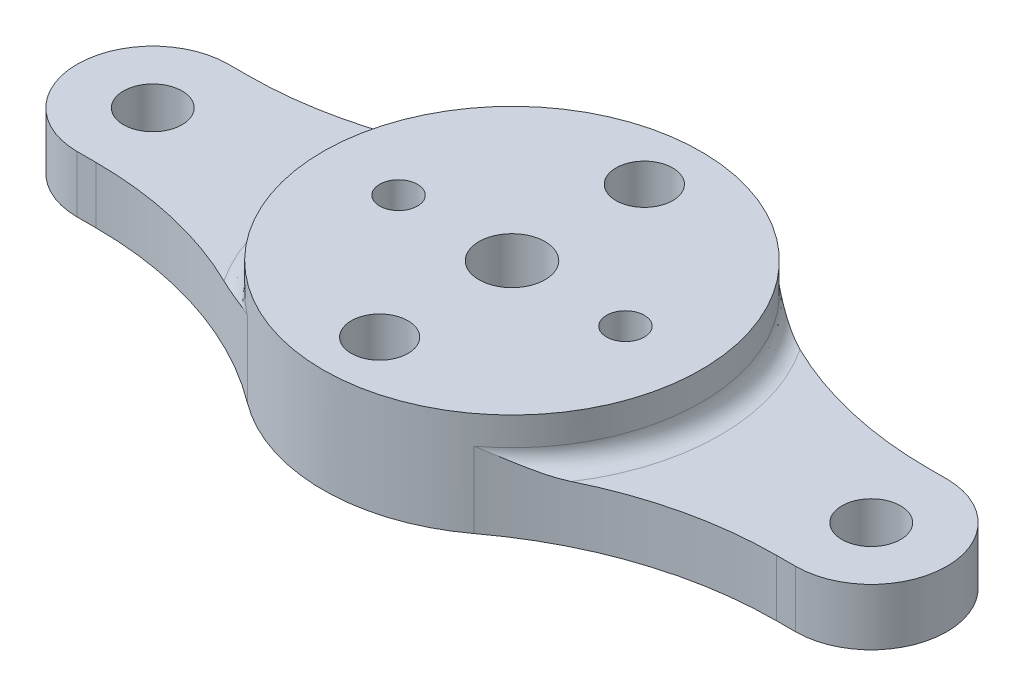
ISO-10303-21;
HEADER;
FILE_DESCRIPTION(('STEP AP214'),'2;1');
FILE_NAME('part.step','',(''),(''),'','','');
FILE_SCHEMA(('AUTOMOTIVE_DESIGN { 1 0 10303 214 1 1 1 1 }'));
ENDSEC;
DATA;
#1=APPLICATION_CONTEXT('core data for automotive mechanical design processes');
#2=APPLICATION_PROTOCOL_DEFINITION('international standard','automotive_design',2000,#1);
#3=PRODUCT_CONTEXT('',#1,'mechanical');
#4=PRODUCT('Part','Part','',(#3));
#5=PRODUCT_RELATED_PRODUCT_CATEGORY('part','',(#4));
#6=PRODUCT_DEFINITION_FORMATION('','',#4);
#7=PRODUCT_DEFINITION_CONTEXT('part definition',#1,'design');
#8=PRODUCT_DEFINITION('design','',#6,#7);
#9=PRODUCT_DEFINITION_SHAPE('','',#8);
#10=(LENGTH_UNIT() NAMED_UNIT(*) SI_UNIT(.MILLI.,.METRE.));
#11=(NAMED_UNIT(*) PLANE_ANGLE_UNIT() SI_UNIT($,.RADIAN.));
#12=(NAMED_UNIT(*) SI_UNIT($,.STERADIAN.) SOLID_ANGLE_UNIT());
#13=UNCERTAINTY_MEASURE_WITH_UNIT(LENGTH_MEASURE(1.E-05),#10,'distance_accuracy_value','');
#14=(GEOMETRIC_REPRESENTATION_CONTEXT(3) GLOBAL_UNCERTAINTY_ASSIGNED_CONTEXT((#13)) GLOBAL_UNIT_ASSIGNED_CONTEXT((#10,
#11,#12)) REPRESENTATION_CONTEXT('',''));
#15=CARTESIAN_POINT('',(0.,0.,0.));
#16=DIRECTION('',(0.,0.,1.));
#17=DIRECTION('',(1.,0.,0.));
#18=AXIS2_PLACEMENT_3D('',#15,#16,#17);
#19=CARTESIAN_POINT('',(0.,-2.49999999998515E-05,-7.));
#20=DIRECTION('',(0.,1.,0.));
#21=DIRECTION('',(0.,0.,1.));
#22=AXIS2_PLACEMENT_3D('',#19,#20,#21);
#23=CYLINDRICAL_SURFACE('',#22,1.5);
#24=CARTESIAN_POINT('',(0.,5.5,-7.));
#25=DIRECTION('',(0.,1.,0.));
#26=DIRECTION('',(0.,0.,1.));
#27=AXIS2_PLACEMENT_3D('',#24,#25,#26);
#28=CIRCLE('',#27,1.5);
#29=CARTESIAN_POINT('',(0.,5.5,-5.5));
#30=VERTEX_POINT('',#29);
#31=EDGE_CURVE('E337',#30,#30,#28,.T.);
#32=ORIENTED_EDGE('',*,*,#31,.T.);
#33=EDGE_LOOP('',(#32));
#34=FACE_BOUND('',#33,.T.);
#35=CARTESIAN_POINT('',(0.,2.1,-7.));
#36=DIRECTION('',(0.,-1.,0.));
#37=DIRECTION('',(0.,0.,-1.));
#38=AXIS2_PLACEMENT_3D('',#35,#36,#37);
#39=CIRCLE('',#38,1.5);
#40=CARTESIAN_POINT('',(0.,2.1,-8.5));
#41=VERTEX_POINT('',#40);
#42=EDGE_CURVE('E293',#41,#41,#39,.F.);
#43=ORIENTED_EDGE('',*,*,#42,.F.);
#44=EDGE_LOOP('',(#43));
#45=FACE_BOUND('',#44,.T.);
#46=ADVANCED_FACE('F35',(#34,#45),#23,.F.);
#47=CARTESIAN_POINT('',(0.,-2.49999999998515E-05,7.));
#48=DIRECTION('',(0.,1.,0.));
#49=DIRECTION('',(0.,0.,1.));
#50=AXIS2_PLACEMENT_3D('',#47,#48,#49);
#51=CYLINDRICAL_SURFACE('',#50,1.5);
#52=CARTESIAN_POINT('',(0.,5.5,7.));
#53=DIRECTION('',(0.,1.,0.));
#54=DIRECTION('',(0.,0.,1.));
#55=AXIS2_PLACEMENT_3D('',#52,#53,#54);
#56=CIRCLE('',#55,1.5);
#57=CARTESIAN_POINT('',(0.,5.5,8.5));
#58=VERTEX_POINT('',#57);
#59=EDGE_CURVE('E334',#58,#58,#56,.T.);
#60=ORIENTED_EDGE('',*,*,#59,.T.);
#61=EDGE_LOOP('',(#60));
#62=FACE_BOUND('',#61,.T.);
#63=CARTESIAN_POINT('',(0.,2.1,7.));
#64=DIRECTION('',(0.,-1.,0.));
#65=DIRECTION('',(0.,0.,-1.));
#66=AXIS2_PLACEMENT_3D('',#63,#64,#65);
#67=CIRCLE('',#66,1.5);
#68=CARTESIAN_POINT('',(0.,2.1,5.5));
#69=VERTEX_POINT('',#68);
#70=EDGE_CURVE('E306',#69,#69,#67,.F.);
#71=ORIENTED_EDGE('',*,*,#70,.F.);
#72=EDGE_LOOP('',(#71));
#73=FACE_BOUND('',#72,.T.);
#74=ADVANCED_FACE('F380',(#62,#73),#51,.F.);
#75=CARTESIAN_POINT('',(0.,3.,0.));
#76=DIRECTION('',(0.,1.,0.));
#77=DIRECTION('',(0.,0.,1.));
#78=AXIS2_PLACEMENT_3D('',#75,#76,#77);
#79=PLANE('',#78);
#80=CARTESIAN_POINT('',(18.,3.,-24.));
#81=DIRECTION('',(0.,1.,0.));
#82=DIRECTION('',(0.,0.,1.));
#83=AXIS2_PLACEMENT_3D('',#80,#81,#82);
#84=CIRCLE('',#83,20.);
#85=CARTESIAN_POINT('',(18.,3.,-4.));
#86=VERTEX_POINT('',#85);
#87=CARTESIAN_POINT('',(9.19020133548054,3.,-6.0448489983896));
#88=VERTEX_POINT('',#87);
#89=EDGE_CURVE('E217',#86,#88,#84,.F.);
#90=ORIENTED_EDGE('',*,*,#89,.T.);
#91=CARTESIAN_POINT('',(0.,3.,0.));
#92=DIRECTION('',(0.,1.,0.));
#93=DIRECTION('',(0.,0.,1.));
#94=AXIS2_PLACEMENT_3D('',#91,#92,#93);
#95=CIRCLE('',#94,11.);
#96=CARTESIAN_POINT('',(9.19020133548054,3.,6.0448489983896));
#97=VERTEX_POINT('',#96);
#98=EDGE_CURVE('E236',#88,#97,#95,.F.);
#99=ORIENTED_EDGE('',*,*,#98,.T.);
#100=CARTESIAN_POINT('',(18.,3.,24.));
#101=DIRECTION('',(0.,1.,0.));
#102=DIRECTION('',(0.,0.,1.));
#103=AXIS2_PLACEMENT_3D('',#100,#101,#102);
#104=CIRCLE('',#103,20.);
#105=CARTESIAN_POINT('',(18.,3.,4.));
#106=VERTEX_POINT('',#105);
#107=EDGE_CURVE('E150',#97,#106,#104,.F.);
#108=ORIENTED_EDGE('',*,*,#107,.T.);
#109=DIRECTION('',(1.,0.,0.));
#110=VECTOR('',#109,1.);
#111=CARTESIAN_POINT('',(9.16515138991168,3.,4.));
#112=LINE('',#111,#110);
#113=CARTESIAN_POINT('',(19.,3.,4.));
#114=VERTEX_POINT('',#113);
#115=EDGE_CURVE('E140',#106,#114,#112,.T.);
#116=ORIENTED_EDGE('',*,*,#115,.T.);
#117=CARTESIAN_POINT('',(19.,3.,0.));
#118=DIRECTION('',(0.,1.,0.));
#119=DIRECTION('',(0.,0.,1.));
#120=AXIS2_PLACEMENT_3D('',#117,#118,#119);
#121=CIRCLE('',#120,4.);
#122=CARTESIAN_POINT('',(19.,3.,-4.));
#123=VERTEX_POINT('',#122);
#124=EDGE_CURVE('E147',#114,#123,#121,.T.);
#125=ORIENTED_EDGE('',*,*,#124,.T.);
#126=DIRECTION('',(-1.,0.,0.));
#127=VECTOR('',#126,1.);
#128=CARTESIAN_POINT('',(9.16515138991168,3.,-4.));
#129=LINE('',#128,#127);
#130=EDGE_CURVE('E169',#123,#86,#129,.T.);
#131=ORIENTED_EDGE('',*,*,#130,.T.);
#132=EDGE_LOOP('',(#90,#99,#108,#116,#125,#131));
#133=FACE_BOUND('',#132,.T.);
#134=CARTESIAN_POINT('',(19.,3.,0.));
#135=DIRECTION('',(0.,1.,0.));
#136=DIRECTION('',(0.,0.,1.));
#137=AXIS2_PLACEMENT_3D('',#134,#135,#136);
#138=CIRCLE('',#137,1.55);
#139=CARTESIAN_POINT('',(19.,3.,1.55));
#140=VERTEX_POINT('',#139);
#141=EDGE_CURVE('E350',#140,#140,#138,.T.);
#142=ORIENTED_EDGE('',*,*,#141,.F.);
#143=EDGE_LOOP('',(#142));
#144=FACE_BOUND('',#143,.T.);
#145=ADVANCED_FACE('F143',(#133,#144),#79,.T.);
#146=CARTESIAN_POINT('',(-18.,3.,24.));
#147=DIRECTION('',(0.,1.,0.));
#148=DIRECTION('',(0.,0.,1.));
#149=AXIS2_PLACEMENT_3D('',#146,#147,#148);
#150=CIRCLE('',#149,20.);
#151=CARTESIAN_POINT('',(-18.,3.,4.));
#152=VERTEX_POINT('',#151);
#153=CARTESIAN_POINT('',(-9.19020133548054,3.,6.04484899838959));
#154=VERTEX_POINT('',#153);
#155=EDGE_CURVE('E225',#152,#154,#150,.F.);
#156=ORIENTED_EDGE('',*,*,#155,.T.);
#157=CARTESIAN_POINT('',(0.,3.,0.));
#158=DIRECTION('',(0.,1.,0.));
#159=DIRECTION('',(0.,0.,1.));
#160=AXIS2_PLACEMENT_3D('',#157,#158,#159);
#161=CIRCLE('',#160,11.);
#162=CARTESIAN_POINT('',(-9.19020133548054,3.,-6.04484899838959));
#163=VERTEX_POINT('',#162);
#164=EDGE_CURVE('E61',#154,#163,#161,.F.);
#165=ORIENTED_EDGE('',*,*,#164,.T.);
#166=CARTESIAN_POINT('',(-18.,3.,-24.));
#167=DIRECTION('',(0.,1.,0.));
#168=DIRECTION('',(0.,0.,1.));
#169=AXIS2_PLACEMENT_3D('',#166,#167,#168);
#170=CIRCLE('',#169,20.);
#171=CARTESIAN_POINT('',(-18.,3.,-4.));
#172=VERTEX_POINT('',#171);
#173=EDGE_CURVE('E221',#163,#172,#170,.F.);
#174=ORIENTED_EDGE('',*,*,#173,.T.);
#175=DIRECTION('',(-1.,0.,0.));
#176=VECTOR('',#175,1.);
#177=CARTESIAN_POINT('',(-19.,3.,-4.));
#178=LINE('',#177,#176);
#179=CARTESIAN_POINT('',(-19.,3.,-4.));
#180=VERTEX_POINT('',#179);
#181=EDGE_CURVE('E171',#172,#180,#178,.T.);
#182=ORIENTED_EDGE('',*,*,#181,.T.);
#183=CARTESIAN_POINT('',(-19.,3.,0.));
#184=DIRECTION('',(0.,1.,0.));
#185=DIRECTION('',(0.,0.,1.));
#186=AXIS2_PLACEMENT_3D('',#183,#184,#185);
#187=CIRCLE('',#186,4.);
#188=CARTESIAN_POINT('',(-19.,3.,4.));
#189=VERTEX_POINT('',#188);
#190=EDGE_CURVE('E177',#180,#189,#187,.T.);
#191=ORIENTED_EDGE('',*,*,#190,.T.);
#192=DIRECTION('',(1.,0.,0.));
#193=VECTOR('',#192,1.);
#194=CARTESIAN_POINT('',(-19.,3.,4.));
#195=LINE('',#194,#193);
#196=EDGE_CURVE('E179',#189,#152,#195,.T.);
#197=ORIENTED_EDGE('',*,*,#196,.T.);
#198=EDGE_LOOP('',(#156,#165,#174,#182,#191,#197));
#199=FACE_BOUND('',#198,.T.);
#200=CARTESIAN_POINT('',(-19.,3.,0.));
#201=DIRECTION('',(0.,1.,0.));
#202=DIRECTION('',(0.,0.,1.));
#203=AXIS2_PLACEMENT_3D('',#200,#201,#202);
#204=CIRCLE('',#203,1.55);
#205=CARTESIAN_POINT('',(-19.,3.,1.55));
#206=VERTEX_POINT('',#205);
#207=EDGE_CURVE('E183',#206,#206,#204,.T.);
#208=ORIENTED_EDGE('',*,*,#207,.F.);
#209=EDGE_LOOP('',(#208));
#210=FACE_BOUND('',#209,.T.);
#211=ADVANCED_FACE('F431',(#199,#210),#79,.T.);
#212=CARTESIAN_POINT('',(0.,0.,0.));
#213=DIRECTION('',(0.,1.,0.));
#214=DIRECTION('',(0.,0.,1.));
#215=AXIS2_PLACEMENT_3D('',#212,#213,#214);
#216=PLANE('',#215);
#217=CARTESIAN_POINT('',(0.,0.,-7.));
#218=DIRECTION('',(0.,-1.,0.));
#219=DIRECTION('',(0.,0.,-1.));
#220=AXIS2_PLACEMENT_3D('',#217,#218,#219);
#221=CIRCLE('',#220,2.6);
#222=CARTESIAN_POINT('',(0.,0.,-9.6));
#223=VERTEX_POINT('',#222);
#224=EDGE_CURVE('E323',#223,#223,#221,.T.);
#225=ORIENTED_EDGE('',*,*,#224,.F.);
#226=EDGE_LOOP('',(#225));
#227=FACE_BOUND('',#226,.T.);
#228=CARTESIAN_POINT('',(0.,0.,7.));
#229=DIRECTION('',(0.,-1.,0.));
#230=DIRECTION('',(0.,0.,-1.));
#231=AXIS2_PLACEMENT_3D('',#228,#229,#230);
#232=CIRCLE('',#231,2.6);
#233=CARTESIAN_POINT('',(0.,0.,4.4));
#234=VERTEX_POINT('',#233);
#235=EDGE_CURVE('E316',#234,#234,#232,.T.);
#236=ORIENTED_EDGE('',*,*,#235,.F.);
#237=EDGE_LOOP('',(#236));
#238=FACE_BOUND('',#237,.T.);
#239=CARTESIAN_POINT('',(6.,0.,0.));
#240=DIRECTION('',(0.,1.,0.));
#241=DIRECTION('',(0.,0.,1.));
#242=AXIS2_PLACEMENT_3D('',#239,#240,#241);
#243=CIRCLE('',#242,1.);
#244=CARTESIAN_POINT('',(6.,0.,1.));
#245=VERTEX_POINT('',#244);
#246=EDGE_CURVE('E313',#245,#245,#243,.T.);
#247=ORIENTED_EDGE('',*,*,#246,.T.);
#248=EDGE_LOOP('',(#247));
#249=FACE_BOUND('',#248,.T.);
#250=CARTESIAN_POINT('',(-6.,0.,0.));
#251=DIRECTION('',(0.,1.,0.));
#252=DIRECTION('',(0.,0.,1.));
#253=AXIS2_PLACEMENT_3D('',#250,#251,#252);
#254=CIRCLE('',#253,1.);
#255=CARTESIAN_POINT('',(-6.,0.,1.));
#256=VERTEX_POINT('',#255);
#257=EDGE_CURVE('E331',#256,#256,#254,.T.);
#258=ORIENTED_EDGE('',*,*,#257,.T.);
#259=EDGE_LOOP('',(#258));
#260=FACE_BOUND('',#259,.T.);
#261=CARTESIAN_POINT('',(0.,0.,0.));
#262=DIRECTION('',(0.,1.,0.));
#263=DIRECTION('',(0.,0.,1.));
#264=AXIS2_PLACEMENT_3D('',#261,#262,#263);
#265=CIRCLE('',#264,1.75);
#266=CARTESIAN_POINT('',(0.,0.,1.75));
#267=VERTEX_POINT('',#266);
#268=EDGE_CURVE('E343',#267,#267,#265,.T.);
#269=ORIENTED_EDGE('',*,*,#268,.T.);
#270=EDGE_LOOP('',(#269));
#271=FACE_BOUND('',#270,.T.);
#272=CARTESIAN_POINT('',(0.,0.,0.));
#273=DIRECTION('',(0.,1.,0.));
#274=DIRECTION('',(0.,0.,1.));
#275=AXIS2_PLACEMENT_3D('',#272,#273,#274);
#276=CIRCLE('',#275,10.);
#277=CARTESIAN_POINT('',(-6.,0.,8.));
#278=VERTEX_POINT('',#277);
#279=CARTESIAN_POINT('',(6.,0.,8.));
#280=VERTEX_POINT('',#279);
#281=EDGE_CURVE('E180',#278,#280,#276,.T.);
#282=ORIENTED_EDGE('',*,*,#281,.F.);
#283=CARTESIAN_POINT('',(-18.,0.,24.));
#284=DIRECTION('',(0.,1.,0.));
#285=DIRECTION('',(0.,0.,1.));
#286=AXIS2_PLACEMENT_3D('',#283,#284,#285);
#287=CIRCLE('',#286,20.);
#288=CARTESIAN_POINT('',(-18.,0.,4.));
#289=VERTEX_POINT('',#288);
#290=EDGE_CURVE('E223',#278,#289,#287,.T.);
#291=ORIENTED_EDGE('',*,*,#290,.T.);
#292=DIRECTION('',(1.,0.,0.));
#293=VECTOR('',#292,1.);
#294=CARTESIAN_POINT('',(-19.,0.,4.));
#295=LINE('',#294,#293);
#296=CARTESIAN_POINT('',(-19.,0.,4.));
#297=VERTEX_POINT('',#296);
#298=EDGE_CURVE('E154',#297,#289,#295,.T.);
#299=ORIENTED_EDGE('',*,*,#298,.F.);
#300=CARTESIAN_POINT('',(-19.,0.,0.));
#301=DIRECTION('',(0.,1.,0.));
#302=DIRECTION('',(0.,0.,1.));
#303=AXIS2_PLACEMENT_3D('',#300,#301,#302);
#304=CIRCLE('',#303,4.);
#305=CARTESIAN_POINT('',(-19.,0.,-4.));
#306=VERTEX_POINT('',#305);
#307=EDGE_CURVE('E195',#306,#297,#304,.T.);
#308=ORIENTED_EDGE('',*,*,#307,.F.);
#309=DIRECTION('',(-1.,0.,0.));
#310=VECTOR('',#309,1.);
#311=CARTESIAN_POINT('',(-19.,0.,-4.));
#312=LINE('',#311,#310);
#313=CARTESIAN_POINT('',(-18.,0.,-4.));
#314=VERTEX_POINT('',#313);
#315=EDGE_CURVE('E193',#314,#306,#312,.T.);
#316=ORIENTED_EDGE('',*,*,#315,.F.);
#317=CARTESIAN_POINT('',(-18.,0.,-24.));
#318=DIRECTION('',(0.,1.,0.));
#319=DIRECTION('',(0.,0.,1.));
#320=AXIS2_PLACEMENT_3D('',#317,#318,#319);
#321=CIRCLE('',#320,20.);
#322=CARTESIAN_POINT('',(-6.,0.,-8.));
#323=VERTEX_POINT('',#322);
#324=EDGE_CURVE('E219',#314,#323,#321,.T.);
#325=ORIENTED_EDGE('',*,*,#324,.T.);
#326=CARTESIAN_POINT('',(0.,0.,0.));
#327=DIRECTION('',(0.,1.,0.));
#328=DIRECTION('',(0.,0.,1.));
#329=AXIS2_PLACEMENT_3D('',#326,#327,#328);
#330=CIRCLE('',#329,10.);
#331=CARTESIAN_POINT('',(6.,0.,-8.));
#332=VERTEX_POINT('',#331);
#333=EDGE_CURVE('E190',#332,#323,#330,.T.);
#334=ORIENTED_EDGE('',*,*,#333,.F.);
#335=CARTESIAN_POINT('',(18.,0.,-24.));
#336=DIRECTION('',(0.,1.,0.));
#337=DIRECTION('',(0.,0.,1.));
#338=AXIS2_PLACEMENT_3D('',#335,#336,#337);
#339=CIRCLE('',#338,20.);
#340=CARTESIAN_POINT('',(18.,0.,-4.));
#341=VERTEX_POINT('',#340);
#342=EDGE_CURVE('E215',#332,#341,#339,.T.);
#343=ORIENTED_EDGE('',*,*,#342,.T.);
#344=DIRECTION('',(-1.,0.,0.));
#345=VECTOR('',#344,1.);
#346=CARTESIAN_POINT('',(9.16515138991168,0.,-4.));
#347=LINE('',#346,#345);
#348=CARTESIAN_POINT('',(19.,0.,-4.));
#349=VERTEX_POINT('',#348);
#350=EDGE_CURVE('E187',#349,#341,#347,.T.);
#351=ORIENTED_EDGE('',*,*,#350,.F.);
#352=CARTESIAN_POINT('',(19.,0.,0.));
#353=DIRECTION('',(0.,1.,0.));
#354=DIRECTION('',(0.,0.,1.));
#355=AXIS2_PLACEMENT_3D('',#352,#353,#354);
#356=CIRCLE('',#355,4.);
#357=CARTESIAN_POINT('',(19.,0.,4.));
#358=VERTEX_POINT('',#357);
#359=EDGE_CURVE('E185',#358,#349,#356,.T.);
#360=ORIENTED_EDGE('',*,*,#359,.F.);
#361=DIRECTION('',(1.,0.,0.));
#362=VECTOR('',#361,1.);
#363=CARTESIAN_POINT('',(9.16515138991168,0.,4.));
#364=LINE('',#363,#362);
#365=CARTESIAN_POINT('',(18.,0.,4.));
#366=VERTEX_POINT('',#365);
#367=EDGE_CURVE('E160',#366,#358,#364,.T.);
#368=ORIENTED_EDGE('',*,*,#367,.F.);
#369=CARTESIAN_POINT('',(18.,0.,24.));
#370=DIRECTION('',(0.,1.,0.));
#371=DIRECTION('',(0.,0.,1.));
#372=AXIS2_PLACEMENT_3D('',#369,#370,#371);
#373=CIRCLE('',#372,20.);
#374=EDGE_CURVE('E227',#366,#280,#373,.T.);
#375=ORIENTED_EDGE('',*,*,#374,.T.);
#376=EDGE_LOOP('',(#282,#291,#299,#308,#316,#325,#334,#343,#351,#360,#368,#375));
#377=FACE_BOUND('',#376,.T.);
#378=CARTESIAN_POINT('',(-19.,0.,0.));
#379=DIRECTION('',(0.,1.,0.));
#380=DIRECTION('',(0.,0.,1.));
#381=AXIS2_PLACEMENT_3D('',#378,#379,#380);
#382=CIRCLE('',#381,1.55);
#383=CARTESIAN_POINT('',(-19.,0.,1.55));
#384=VERTEX_POINT('',#383);
#385=EDGE_CURVE('E175',#384,#384,#382,.T.);
#386=ORIENTED_EDGE('',*,*,#385,.T.);
#387=EDGE_LOOP('',(#386));
#388=FACE_BOUND('',#387,.T.);
#389=CARTESIAN_POINT('',(19.,0.,0.));
#390=DIRECTION('',(0.,1.,0.));
#391=DIRECTION('',(0.,0.,1.));
#392=AXIS2_PLACEMENT_3D('',#389,#390,#391);
#393=CIRCLE('',#392,1.55);
#394=CARTESIAN_POINT('',(19.,0.,1.55));
#395=VERTEX_POINT('',#394);
#396=EDGE_CURVE('E349',#395,#395,#393,.T.);
#397=ORIENTED_EDGE('',*,*,#396,.T.);
#398=EDGE_LOOP('',(#397));
#399=FACE_BOUND('',#398,.T.);
#400=ADVANCED_FACE('F360',(#227,#238,#249,#260,#271,#377,#388,#399),#216,.F.);
#401=CARTESIAN_POINT('',(9.16515138991168,3.,4.));
#402=DIRECTION('',(0.,0.,-1.));
#403=DIRECTION('',(-1.,0.,0.));
#404=AXIS2_PLACEMENT_3D('',#401,#402,#403);
#405=PLANE('',#404);
#406=ORIENTED_EDGE('',*,*,#115,.F.);
#407=DIRECTION('',(0.,1.,0.));
#408=VECTOR('',#407,1.);
#409=CARTESIAN_POINT('',(18.,0.,4.));
#410=LINE('',#409,#408);
#411=EDGE_CURVE('E213',#106,#366,#410,.F.);
#412=ORIENTED_EDGE('',*,*,#411,.T.);
#413=ORIENTED_EDGE('',*,*,#367,.T.);
#414=DIRECTION('',(0.,-1.,0.));
#415=VECTOR('',#414,1.);
#416=CARTESIAN_POINT('',(19.,3.,4.));
#417=LINE('',#416,#415);
#418=EDGE_CURVE('E157',#114,#358,#417,.T.);
#419=ORIENTED_EDGE('',*,*,#418,.F.);
#420=EDGE_LOOP('',(#406,#412,#413,#419));
#421=FACE_BOUND('',#420,.T.);
#422=ADVANCED_FACE('F158',(#421),#405,.F.);
#423=CARTESIAN_POINT('',(19.,3.,0.));
#424=DIRECTION('',(0.,-1.,0.));
#425=DIRECTION('',(0.,0.,-1.));
#426=AXIS2_PLACEMENT_3D('',#423,#424,#425);
#427=CYLINDRICAL_SURFACE('',#426,4.);
#428=ORIENTED_EDGE('',*,*,#359,.T.);
#429=DIRECTION('',(0.,-1.,0.));
#430=VECTOR('',#429,1.);
#431=CARTESIAN_POINT('',(19.,3.,-4.));
#432=LINE('',#431,#430);
#433=EDGE_CURVE('E164',#123,#349,#432,.T.);
#434=ORIENTED_EDGE('',*,*,#433,.F.);
#435=ORIENTED_EDGE('',*,*,#124,.F.);
#436=ORIENTED_EDGE('',*,*,#418,.T.);
#437=EDGE_LOOP('',(#428,#434,#435,#436));
#438=FACE_BOUND('',#437,.T.);
#439=ADVANCED_FACE('F166',(#438),#427,.T.);
#440=CARTESIAN_POINT('',(9.16515138991168,3.,-4.));
#441=DIRECTION('',(0.,0.,1.));
#442=DIRECTION('',(1.,0.,0.));
#443=AXIS2_PLACEMENT_3D('',#440,#441,#442);
#444=PLANE('',#443);
#445=ORIENTED_EDGE('',*,*,#350,.T.);
#446=DIRECTION('',(0.,1.,0.));
#447=VECTOR('',#446,1.);
#448=CARTESIAN_POINT('',(18.,3.,-4.));
#449=LINE('',#448,#447);
#450=EDGE_CURVE('E298',#341,#86,#449,.T.);
#451=ORIENTED_EDGE('',*,*,#450,.T.);
#452=ORIENTED_EDGE('',*,*,#130,.F.);
#453=ORIENTED_EDGE('',*,*,#433,.T.);
#454=EDGE_LOOP('',(#445,#451,#452,#453));
#455=FACE_BOUND('',#454,.T.);
#456=ADVANCED_FACE('F413',(#455),#444,.F.);
#457=CARTESIAN_POINT('',(0.,3.,0.));
#458=DIRECTION('',(0.,-1.,0.));
#459=DIRECTION('',(0.,0.,-1.));
#460=AXIS2_PLACEMENT_3D('',#457,#458,#459);
#461=CYLINDRICAL_SURFACE('',#460,10.);
#462=CARTESIAN_POINT('',(0.,4.,0.));
#463=DIRECTION('',(0.,1.,0.));
#464=DIRECTION('',(0.,0.,1.));
#465=AXIS2_PLACEMENT_3D('',#462,#463,#464);
#466=CIRCLE('',#465,10.);
#467=CARTESIAN_POINT('',(6.,4.,8.));
#468=VERTEX_POINT('',#467);
#469=CARTESIAN_POINT('',(6.,4.,-8.));
#470=VERTEX_POINT('',#469);
#471=EDGE_CURVE('E233',#468,#470,#466,.T.);
#472=ORIENTED_EDGE('',*,*,#471,.T.);
#473=DIRECTION('',(0.,-1.,0.));
#474=VECTOR('',#473,1.);
#475=CARTESIAN_POINT('',(6.,3.,-8.));
#476=LINE('',#475,#474);
#477=EDGE_CURVE('E284',#470,#332,#476,.T.);
#478=ORIENTED_EDGE('',*,*,#477,.T.);
#479=ORIENTED_EDGE('',*,*,#333,.T.);
#480=DIRECTION('',(0.,-1.,0.));
#481=VECTOR('',#480,1.);
#482=CARTESIAN_POINT('',(-6.,3.,-8.));
#483=LINE('',#482,#481);
#484=CARTESIAN_POINT('',(-6.,4.,-8.));
#485=VERTEX_POINT('',#484);
#486=EDGE_CURVE('E290',#323,#485,#483,.F.);
#487=ORIENTED_EDGE('',*,*,#486,.T.);
#488=CARTESIAN_POINT('',(0.,4.,0.));
#489=DIRECTION('',(0.,1.,0.));
#490=DIRECTION('',(0.,0.,1.));
#491=AXIS2_PLACEMENT_3D('',#488,#489,#490);
#492=CIRCLE('',#491,10.);
#493=CARTESIAN_POINT('',(-6.,4.,8.));
#494=VERTEX_POINT('',#493);
#495=EDGE_CURVE('E230',#485,#494,#492,.T.);
#496=ORIENTED_EDGE('',*,*,#495,.T.);
#497=DIRECTION('',(0.,-1.,0.));
#498=VECTOR('',#497,1.);
#499=CARTESIAN_POINT('',(-6.,3.,8.));
#500=LINE('',#499,#498);
#501=EDGE_CURVE('E288',#494,#278,#500,.T.);
#502=ORIENTED_EDGE('',*,*,#501,.T.);
#503=ORIENTED_EDGE('',*,*,#281,.T.);
#504=DIRECTION('',(0.,-1.,0.));
#505=VECTOR('',#504,1.);
#506=CARTESIAN_POINT('',(6.,3.,8.));
#507=LINE('',#506,#505);
#508=EDGE_CURVE('E163',#280,#468,#507,.F.);
#509=ORIENTED_EDGE('',*,*,#508,.T.);
#510=EDGE_LOOP('',(#472,#478,#479,#487,#496,#502,#503,#509));
#511=FACE_BOUND('',#510,.T.);
#512=CARTESIAN_POINT('',(0.,5.5,0.));
#513=DIRECTION('',(0.,1.,0.));
#514=DIRECTION('',(0.,0.,1.));
#515=AXIS2_PLACEMENT_3D('',#512,#513,#514);
#516=CIRCLE('',#515,10.);
#517=CARTESIAN_POINT('',(0.,5.5,10.));
#518=VERTEX_POINT('',#517);
#519=EDGE_CURVE('E346',#518,#518,#516,.T.);
#520=ORIENTED_EDGE('',*,*,#519,.F.);
#521=EDGE_LOOP('',(#520));
#522=FACE_BOUND('',#521,.T.);
#523=ADVANCED_FACE('F282',(#511,#522),#461,.T.);
#524=CARTESIAN_POINT('',(-19.,3.,-4.));
#525=DIRECTION('',(0.,0.,1.));
#526=DIRECTION('',(1.,0.,0.));
#527=AXIS2_PLACEMENT_3D('',#524,#525,#526);
#528=PLANE('',#527);
#529=ORIENTED_EDGE('',*,*,#181,.F.);
#530=DIRECTION('',(0.,1.,0.));
#531=VECTOR('',#530,1.);
#532=CARTESIAN_POINT('',(-18.,0.,-4.));
#533=LINE('',#532,#531);
#534=EDGE_CURVE('E300',#172,#314,#533,.F.);
#535=ORIENTED_EDGE('',*,*,#534,.T.);
#536=ORIENTED_EDGE('',*,*,#315,.T.);
#537=DIRECTION('',(0.,-1.,0.));
#538=VECTOR('',#537,1.);
#539=CARTESIAN_POINT('',(-19.,3.,-4.));
#540=LINE('',#539,#538);
#541=EDGE_CURVE('E202',#180,#306,#540,.T.);
#542=ORIENTED_EDGE('',*,*,#541,.F.);
#543=EDGE_LOOP('',(#529,#535,#536,#542));
#544=FACE_BOUND('',#543,.T.);
#545=ADVANCED_FACE('F412',(#544),#528,.F.);
#546=CARTESIAN_POINT('',(-19.,3.,0.));
#547=DIRECTION('',(0.,-1.,0.));
#548=DIRECTION('',(0.,0.,-1.));
#549=AXIS2_PLACEMENT_3D('',#546,#547,#548);
#550=CYLINDRICAL_SURFACE('',#549,4.);
#551=ORIENTED_EDGE('',*,*,#307,.T.);
#552=DIRECTION('',(0.,-1.,0.));
#553=VECTOR('',#552,1.);
#554=CARTESIAN_POINT('',(-19.,3.,4.));
#555=LINE('',#554,#553);
#556=EDGE_CURVE('E199',#189,#297,#555,.T.);
#557=ORIENTED_EDGE('',*,*,#556,.F.);
#558=ORIENTED_EDGE('',*,*,#190,.F.);
#559=ORIENTED_EDGE('',*,*,#541,.T.);
#560=EDGE_LOOP('',(#551,#557,#558,#559));
#561=FACE_BOUND('',#560,.T.);
#562=ADVANCED_FACE('F375',(#561),#550,.T.);
#563=CARTESIAN_POINT('',(-19.,3.,4.));
#564=DIRECTION('',(0.,0.,-1.));
#565=DIRECTION('',(-1.,0.,0.));
#566=AXIS2_PLACEMENT_3D('',#563,#564,#565);
#567=PLANE('',#566);
#568=ORIENTED_EDGE('',*,*,#298,.T.);
#569=DIRECTION('',(0.,1.,0.));
#570=VECTOR('',#569,1.);
#571=CARTESIAN_POINT('',(-18.,3.,4.));
#572=LINE('',#571,#570);
#573=EDGE_CURVE('E211',#289,#152,#572,.T.);
#574=ORIENTED_EDGE('',*,*,#573,.T.);
#575=ORIENTED_EDGE('',*,*,#196,.F.);
#576=ORIENTED_EDGE('',*,*,#556,.T.);
#577=EDGE_LOOP('',(#568,#574,#575,#576));
#578=FACE_BOUND('',#577,.T.);
#579=ADVANCED_FACE('F366',(#578),#567,.F.);
#580=CARTESIAN_POINT('',(-19.,3.,0.));
#581=DIRECTION('',(0.,-1.,0.));
#582=DIRECTION('',(0.,0.,-1.));
#583=AXIS2_PLACEMENT_3D('',#580,#581,#582);
#584=CYLINDRICAL_SURFACE('',#583,1.55);
#585=ORIENTED_EDGE('',*,*,#207,.T.);
#586=EDGE_LOOP('',(#585));
#587=FACE_BOUND('',#586,.T.);
#588=ORIENTED_EDGE('',*,*,#385,.F.);
#589=EDGE_LOOP('',(#588));
#590=FACE_BOUND('',#589,.T.);
#591=ADVANCED_FACE('F363',(#587,#590),#584,.F.);
#592=CARTESIAN_POINT('',(19.,3.,0.));
#593=DIRECTION('',(0.,-1.,0.));
#594=DIRECTION('',(0.,0.,-1.));
#595=AXIS2_PLACEMENT_3D('',#592,#593,#594);
#596=CYLINDRICAL_SURFACE('',#595,1.55);
#597=ORIENTED_EDGE('',*,*,#141,.T.);
#598=EDGE_LOOP('',(#597));
#599=FACE_BOUND('',#598,.T.);
#600=ORIENTED_EDGE('',*,*,#396,.F.);
#601=EDGE_LOOP('',(#600));
#602=FACE_BOUND('',#601,.T.);
#603=ADVANCED_FACE('F365',(#599,#602),#596,.F.);
#604=CARTESIAN_POINT('',(0.,5.5,0.));
#605=DIRECTION('',(0.,1.,0.));
#606=DIRECTION('',(0.,0.,1.));
#607=AXIS2_PLACEMENT_3D('',#604,#605,#606);
#608=PLANE('',#607);
#609=CARTESIAN_POINT('',(6.,5.5,0.));
#610=DIRECTION('',(0.,1.,0.));
#611=DIRECTION('',(0.,0.,1.));
#612=AXIS2_PLACEMENT_3D('',#609,#610,#611);
#613=CIRCLE('',#612,1.);
#614=CARTESIAN_POINT('',(6.,5.5,1.));
#615=VERTEX_POINT('',#614);
#616=EDGE_CURVE('E308',#615,#615,#613,.T.);
#617=ORIENTED_EDGE('',*,*,#616,.F.);
#618=EDGE_LOOP('',(#617));
#619=FACE_BOUND('',#618,.T.);
#620=CARTESIAN_POINT('',(-6.,5.5,0.));
#621=DIRECTION('',(0.,1.,0.));
#622=DIRECTION('',(0.,0.,1.));
#623=AXIS2_PLACEMENT_3D('',#620,#621,#622);
#624=CIRCLE('',#623,1.);
#625=CARTESIAN_POINT('',(-6.,5.5,1.));
#626=VERTEX_POINT('',#625);
#627=EDGE_CURVE('E328',#626,#626,#624,.T.);
#628=ORIENTED_EDGE('',*,*,#627,.F.);
#629=EDGE_LOOP('',(#628));
#630=FACE_BOUND('',#629,.T.);
#631=ORIENTED_EDGE('',*,*,#59,.F.);
#632=EDGE_LOOP('',(#631));
#633=FACE_BOUND('',#632,.T.);
#634=ORIENTED_EDGE('',*,*,#31,.F.);
#635=EDGE_LOOP('',(#634));
#636=FACE_BOUND('',#635,.T.);
#637=CARTESIAN_POINT('',(0.,5.5,0.));
#638=DIRECTION('',(0.,1.,0.));
#639=DIRECTION('',(0.,0.,1.));
#640=AXIS2_PLACEMENT_3D('',#637,#638,#639);
#641=CIRCLE('',#640,1.75);
#642=CARTESIAN_POINT('',(0.,5.5,1.75));
#643=VERTEX_POINT('',#642);
#644=EDGE_CURVE('E340',#643,#643,#641,.T.);
#645=ORIENTED_EDGE('',*,*,#644,.F.);
#646=EDGE_LOOP('',(#645));
#647=FACE_BOUND('',#646,.T.);
#648=ORIENTED_EDGE('',*,*,#519,.T.);
#649=EDGE_LOOP('',(#648));
#650=FACE_BOUND('',#649,.T.);
#651=ADVANCED_FACE('F372',(#619,#630,#633,#636,#647,#650),#608,.T.);
#652=CARTESIAN_POINT('',(0.,-2.49999999998515E-05,0.));
#653=DIRECTION('',(0.,1.,0.));
#654=DIRECTION('',(0.,0.,1.));
#655=AXIS2_PLACEMENT_3D('',#652,#653,#654);
#656=CYLINDRICAL_SURFACE('',#655,1.75);
#657=ORIENTED_EDGE('',*,*,#644,.T.);
#658=EDGE_LOOP('',(#657));
#659=FACE_BOUND('',#658,.T.);
#660=ORIENTED_EDGE('',*,*,#268,.F.);
#661=EDGE_LOOP('',(#660));
#662=FACE_BOUND('',#661,.T.);
#663=ADVANCED_FACE('F391',(#659,#662),#656,.F.);
#664=CARTESIAN_POINT('',(-6.,-2.49999999998515E-05,0.));
#665=DIRECTION('',(0.,1.,0.));
#666=DIRECTION('',(0.,0.,1.));
#667=AXIS2_PLACEMENT_3D('',#664,#665,#666);
#668=CYLINDRICAL_SURFACE('',#667,1.);
#669=ORIENTED_EDGE('',*,*,#627,.T.);
#670=EDGE_LOOP('',(#669));
#671=FACE_BOUND('',#670,.T.);
#672=ORIENTED_EDGE('',*,*,#257,.F.);
#673=EDGE_LOOP('',(#672));
#674=FACE_BOUND('',#673,.T.);
#675=ADVANCED_FACE('F394',(#671,#674),#668,.F.);
#676=CARTESIAN_POINT('',(6.,-2.49999999998515E-05,0.));
#677=DIRECTION('',(0.,1.,0.));
#678=DIRECTION('',(0.,0.,1.));
#679=AXIS2_PLACEMENT_3D('',#676,#677,#678);
#680=CYLINDRICAL_SURFACE('',#679,1.);
#681=ORIENTED_EDGE('',*,*,#616,.T.);
#682=EDGE_LOOP('',(#681));
#683=FACE_BOUND('',#682,.T.);
#684=ORIENTED_EDGE('',*,*,#246,.F.);
#685=EDGE_LOOP('',(#684));
#686=FACE_BOUND('',#685,.T.);
#687=ADVANCED_FACE('F515',(#683,#686),#680,.F.);
#688=CARTESIAN_POINT('',(0.,2.1,7.));
#689=DIRECTION('',(0.,-1.,0.));
#690=DIRECTION('',(0.,0.,-1.));
#691=AXIS2_PLACEMENT_3D('',#688,#689,#690);
#692=PLANE('',#691);
#693=CARTESIAN_POINT('',(0.,2.1,7.));
#694=DIRECTION('',(0.,-1.,0.));
#695=DIRECTION('',(0.,0.,-1.));
#696=AXIS2_PLACEMENT_3D('',#693,#694,#695);
#697=CIRCLE('',#696,2.6);
#698=CARTESIAN_POINT('',(0.,2.1,4.4));
#699=VERTEX_POINT('',#698);
#700=EDGE_CURVE('E309',#699,#699,#697,.T.);
#701=ORIENTED_EDGE('',*,*,#700,.T.);
#702=EDGE_LOOP('',(#701));
#703=FACE_BOUND('',#702,.T.);
#704=ORIENTED_EDGE('',*,*,#70,.T.);
#705=EDGE_LOOP('',(#704));
#706=FACE_BOUND('',#705,.T.);
#707=ADVANCED_FACE('F507',(#703,#706),#692,.T.);
#708=CARTESIAN_POINT('',(0.,2.1,7.));
#709=DIRECTION('',(0.,-1.,0.));
#710=DIRECTION('',(0.,0.,-1.));
#711=AXIS2_PLACEMENT_3D('',#708,#709,#710);
#712=CYLINDRICAL_SURFACE('',#711,2.6);
#713=ORIENTED_EDGE('',*,*,#700,.F.);
#714=EDGE_LOOP('',(#713));
#715=FACE_BOUND('',#714,.T.);
#716=ORIENTED_EDGE('',*,*,#235,.T.);
#717=EDGE_LOOP('',(#716));
#718=FACE_BOUND('',#717,.T.);
#719=ADVANCED_FACE('F499',(#715,#718),#712,.F.);
#720=CARTESIAN_POINT('',(0.,2.1,-7.));
#721=DIRECTION('',(0.,-1.,0.));
#722=DIRECTION('',(0.,0.,-1.));
#723=AXIS2_PLACEMENT_3D('',#720,#721,#722);
#724=PLANE('',#723);
#725=CARTESIAN_POINT('',(0.,2.1,-7.));
#726=DIRECTION('',(0.,-1.,0.));
#727=DIRECTION('',(0.,0.,-1.));
#728=AXIS2_PLACEMENT_3D('',#725,#726,#727);
#729=CIRCLE('',#728,2.6);
#730=CARTESIAN_POINT('',(0.,2.1,-9.6));
#731=VERTEX_POINT('',#730);
#732=EDGE_CURVE('E660',#731,#731,#729,.T.);
#733=ORIENTED_EDGE('',*,*,#732,.T.);
#734=EDGE_LOOP('',(#733));
#735=FACE_BOUND('',#734,.T.);
#736=ORIENTED_EDGE('',*,*,#42,.T.);
#737=EDGE_LOOP('',(#736));
#738=FACE_BOUND('',#737,.T.);
#739=ADVANCED_FACE('F491',(#735,#738),#724,.T.);
#740=CARTESIAN_POINT('',(0.,2.1,-7.));
#741=DIRECTION('',(0.,-1.,0.));
#742=DIRECTION('',(0.,0.,-1.));
#743=AXIS2_PLACEMENT_3D('',#740,#741,#742);
#744=CYLINDRICAL_SURFACE('',#743,2.6);
#745=ORIENTED_EDGE('',*,*,#732,.F.);
#746=EDGE_LOOP('',(#745));
#747=FACE_BOUND('',#746,.T.);
#748=ORIENTED_EDGE('',*,*,#224,.T.);
#749=EDGE_LOOP('',(#748));
#750=FACE_BOUND('',#749,.T.);
#751=ADVANCED_FACE('F257',(#747,#750),#744,.F.);
#752=CARTESIAN_POINT('',(18.,3.,-24.));
#753=DIRECTION('',(0.,-1.,0.));
#754=DIRECTION('',(0.,0.,-1.));
#755=AXIS2_PLACEMENT_3D('',#752,#753,#754);
#756=CYLINDRICAL_SURFACE('',#755,20.);
#757=ORIENTED_EDGE('',*,*,#89,.F.);
#758=ORIENTED_EDGE('',*,*,#450,.F.);
#759=ORIENTED_EDGE('',*,*,#342,.F.);
#760=ORIENTED_EDGE('',*,*,#477,.F.);
#761=CARTESIAN_POINT('',(9.19020133548054,3.,-6.0448489983896));
#762=CARTESIAN_POINT('',(9.12642684579131,3.0000133900098,-6.07613923221575));
#763=CARTESIAN_POINT('',(9.06284169663492,3.001952594447,-6.10776026451368));
#764=CARTESIAN_POINT('',(8.9362019093234,3.00923990191589,-6.17157948242913));
#765=CARTESIAN_POINT('',(8.87314697792431,3.01458597521167,-6.20377731330976));
#766=CARTESIAN_POINT('',(8.74780976890835,3.02822723402026,-6.26861695376668));
#767=CARTESIAN_POINT('',(8.68552588508357,3.0365145567971,-6.30125735861607));
#768=CARTESIAN_POINT('',(8.56161154971691,3.0556866156274,-6.36702678139536));
#769=CARTESIAN_POINT('',(8.49998120897532,3.0665717849871,-6.40015587997087));
#770=CARTESIAN_POINT('',(8.31717463328775,3.10243871111346,-6.49965622330974));
#771=CARTESIAN_POINT('',(8.19701143729971,3.13075991300713,-6.56669535425319));
#772=CARTESIAN_POINT('',(7.9594235686979,3.19435765428867,-6.70244044179102));
#773=CARTESIAN_POINT('',(7.8420011478737,3.22963970224458,-6.77114768045825));
#774=CARTESIAN_POINT('',(7.57534926791569,3.31684011239661,-6.93080340256722));
#775=CARTESIAN_POINT('',(7.42704359062685,3.370585810277,-7.02229069319961));
#776=CARTESIAN_POINT('',(7.1345557390033,3.48429926226976,-7.20797468118396));
#777=CARTESIAN_POINT('',(6.99037493011429,3.54426904700962,-7.3021722554839));
#778=CARTESIAN_POINT('',(6.56278749914985,3.73026006111867,-7.5893796887671));
#779=CARTESIAN_POINT('',(6.28483425255266,3.86218278050878,-7.78670480724419));
#780=CARTESIAN_POINT('',(6.00812260915435,3.9960682399806,-7.99391047237511));
#781=CARTESIAN_POINT('',(6.00406071879748,3.99803413335169,-7.99695447509759));
#782=CARTESIAN_POINT('',(6.,4.,-8.));
#783=B_SPLINE_CURVE_WITH_KNOTS('',3,(#761,#762,#763,#764,#765,#766,#767,#768,#769,#770,#771,
#772,#773,#774,#775,#776,#777,#778,#779,#780,#781,#782),.UNSPECIFIED.,.F.,.F.,(4,2,2,2,2,2,2,2,
2,2,4),(0.,0.213049297743443,0.425971784018119,0.638329307316046,0.850722275443255,
1.27187661585721,1.69336558957682,2.24017836639837,2.78717010673503,3.88297564839496,
3.89930558104255),.UNSPECIFIED.);
#784=EDGE_CURVE('E239',#470,#88,#783,.F.);
#785=ORIENTED_EDGE('',*,*,#784,.T.);
#786=EDGE_LOOP('',(#757,#758,#759,#760,#785));
#787=FACE_BOUND('',#786,.T.);
#788=ADVANCED_FACE('F252',(#787),#756,.F.);
#789=CARTESIAN_POINT('',(-18.,3.,-24.));
#790=DIRECTION('',(0.,-1.,0.));
#791=DIRECTION('',(0.,0.,-1.));
#792=AXIS2_PLACEMENT_3D('',#789,#790,#791);
#793=CYLINDRICAL_SURFACE('',#792,20.);
#794=ORIENTED_EDGE('',*,*,#173,.F.);
#795=CARTESIAN_POINT('',(-9.19020133548054,3.,-6.04484899838959));
#796=CARTESIAN_POINT('',(-9.1264268457911,3.0000133900098,-6.07613923221585));
#797=CARTESIAN_POINT('',(-9.06284169663451,3.00195259444702,-6.10776026451388));
#798=CARTESIAN_POINT('',(-8.93620190932257,3.00923990191595,-6.17157948242954));
#799=CARTESIAN_POINT('',(-8.87314697792329,3.01458597521176,-6.20377731331028));
#800=CARTESIAN_POINT('',(-8.74780976890697,3.02822723402043,-6.26861695376739));
#801=CARTESIAN_POINT('',(-8.68552588508204,3.03651455679732,-6.30125735861687));
#802=CARTESIAN_POINT('',(-8.56161154971508,3.05568661562771,-6.36702678139634));
#803=CARTESIAN_POINT('',(-8.49998120897333,3.06657178498747,-6.40015587997194));
#804=CARTESIAN_POINT('',(-8.31717463328601,3.10243871111386,-6.49965622331071));
#805=CARTESIAN_POINT('',(-8.19701143729837,3.13075991300749,-6.56669535425394));
#806=CARTESIAN_POINT('',(-7.95942356869726,3.19435765428884,-6.70244044179139));
#807=CARTESIAN_POINT('',(-7.84200114787338,3.2296397022446,-6.77114768045844));
#808=CARTESIAN_POINT('',(-7.57534926791579,3.31684011239669,-6.93080340256716));
#809=CARTESIAN_POINT('',(-7.42704359062709,3.3705858102774,-7.02229069319944));
#810=CARTESIAN_POINT('',(-7.1345557390034,3.48429926226925,-7.20797468118391));
#811=CARTESIAN_POINT('',(-6.99037493011412,3.54426904700788,-7.30217225548406));
#812=CARTESIAN_POINT('',(-6.5627874991511,3.73026006112177,-7.58937968876616));
#813=CARTESIAN_POINT('',(-6.2848342525582,3.86218278052638,-7.78670480723994));
#814=CARTESIAN_POINT('',(-6.0081226091545,3.99606823998113,-7.99391047237499));
#815=CARTESIAN_POINT('',(-6.00406071879756,3.99803413335196,-7.99695447509753));
#816=CARTESIAN_POINT('',(-5.99999999999999,4.,-8.));
#817=B_SPLINE_CURVE_WITH_KNOTS('',3,(#795,#796,#797,#798,#799,#800,#801,#802,#803,#804,#805,
#806,#807,#808,#809,#810,#811,#812,#813,#814,#815,#816),.UNSPECIFIED.,.F.,.F.,(4,2,2,2,2,2,2,2,
2,2,4),(0.,0.213049297744143,0.42597178401951,0.638329307317977,0.850722275445732,
1.27187661585836,1.69336558957679,2.2401783663982,2.78717010673452,3.88297564839499,
3.89930558104256),.UNSPECIFIED.);
#818=EDGE_CURVE('E11',#163,#485,#817,.T.);
#819=ORIENTED_EDGE('',*,*,#818,.T.);
#820=ORIENTED_EDGE('',*,*,#486,.F.);
#821=ORIENTED_EDGE('',*,*,#324,.F.);
#822=ORIENTED_EDGE('',*,*,#534,.F.);
#823=EDGE_LOOP('',(#794,#819,#820,#821,#822));
#824=FACE_BOUND('',#823,.T.);
#825=ADVANCED_FACE('F256',(#824),#793,.F.);
#826=CARTESIAN_POINT('',(-18.,3.,24.));
#827=DIRECTION('',(0.,-1.,0.));
#828=DIRECTION('',(0.,0.,-1.));
#829=AXIS2_PLACEMENT_3D('',#826,#827,#828);
#830=CYLINDRICAL_SURFACE('',#829,20.);
#831=ORIENTED_EDGE('',*,*,#155,.F.);
#832=ORIENTED_EDGE('',*,*,#573,.F.);
#833=ORIENTED_EDGE('',*,*,#290,.F.);
#834=ORIENTED_EDGE('',*,*,#501,.F.);
#835=CARTESIAN_POINT('',(-9.19020133548054,3.,6.04484899838959));
#836=CARTESIAN_POINT('',(-9.1264268457911,3.0000133900098,6.07613923221585));
#837=CARTESIAN_POINT('',(-9.06284169663451,3.00195259444702,6.10776026451388));
#838=CARTESIAN_POINT('',(-8.93620190932257,3.00923990191595,6.17157948242954));
#839=CARTESIAN_POINT('',(-8.87314697792329,3.01458597521176,6.20377731331028));
#840=CARTESIAN_POINT('',(-8.74780976890697,3.02822723402043,6.26861695376739));
#841=CARTESIAN_POINT('',(-8.68552588508204,3.03651455679732,6.30125735861687));
#842=CARTESIAN_POINT('',(-8.56161154971508,3.05568661562771,6.36702678139634));
#843=CARTESIAN_POINT('',(-8.49998120897333,3.06657178498747,6.40015587997194));
#844=CARTESIAN_POINT('',(-8.31717463328601,3.10243871111386,6.49965622331071));
#845=CARTESIAN_POINT('',(-8.19701143729837,3.13075991300749,6.56669535425394));
#846=CARTESIAN_POINT('',(-7.95942356869726,3.19435765428884,6.70244044179139));
#847=CARTESIAN_POINT('',(-7.84200114787338,3.2296397022446,6.77114768045844));
#848=CARTESIAN_POINT('',(-7.57534926791579,3.31684011239669,6.93080340256716));
#849=CARTESIAN_POINT('',(-7.42704359062709,3.3705858102774,7.02229069319944));
#850=CARTESIAN_POINT('',(-7.1345557390034,3.48429926226925,7.20797468118391));
#851=CARTESIAN_POINT('',(-6.99037493011412,3.54426904700788,7.30217225548406));
#852=CARTESIAN_POINT('',(-6.5627874991511,3.73026006112177,7.58937968876616));
#853=CARTESIAN_POINT('',(-6.2848342525582,3.86218278052638,7.78670480723994));
#854=CARTESIAN_POINT('',(-6.0081226091545,3.99606823998113,7.99391047237499));
#855=CARTESIAN_POINT('',(-6.00406071879756,3.99803413335196,7.99695447509753));
#856=CARTESIAN_POINT('',(-5.99999999999999,4.,8.));
#857=B_SPLINE_CURVE_WITH_KNOTS('',3,(#835,#836,#837,#838,#839,#840,#841,#842,#843,#844,#845,
#846,#847,#848,#849,#850,#851,#852,#853,#854,#855,#856),.UNSPECIFIED.,.F.,.F.,(4,2,2,2,2,2,2,2,
2,2,4),(0.,0.213049297744143,0.42597178401951,0.638329307317977,0.850722275445732,
1.27187661585836,1.69336558957679,2.2401783663982,2.78717010673452,3.88297564839499,
3.89930558104256),.UNSPECIFIED.);
#858=EDGE_CURVE('E48',#494,#154,#857,.F.);
#859=ORIENTED_EDGE('',*,*,#858,.T.);
#860=EDGE_LOOP('',(#831,#832,#833,#834,#859));
#861=FACE_BOUND('',#860,.T.);
#862=ADVANCED_FACE('F263',(#861),#830,.F.);
#863=CARTESIAN_POINT('',(18.,3.,24.));
#864=DIRECTION('',(0.,-1.,0.));
#865=DIRECTION('',(0.,0.,-1.));
#866=AXIS2_PLACEMENT_3D('',#863,#864,#865);
#867=CYLINDRICAL_SURFACE('',#866,20.);
#868=ORIENTED_EDGE('',*,*,#107,.F.);
#869=CARTESIAN_POINT('',(9.19020133548054,3.,6.0448489983896));
#870=CARTESIAN_POINT('',(9.12642684579131,3.0000133900098,6.07613923221575));
#871=CARTESIAN_POINT('',(9.06284169663492,3.001952594447,6.10776026451368));
#872=CARTESIAN_POINT('',(8.9362019093234,3.00923990191589,6.17157948242913));
#873=CARTESIAN_POINT('',(8.87314697792431,3.01458597521167,6.20377731330976));
#874=CARTESIAN_POINT('',(8.74780976890835,3.02822723402026,6.26861695376668));
#875=CARTESIAN_POINT('',(8.68552588508357,3.0365145567971,6.30125735861607));
#876=CARTESIAN_POINT('',(8.56161154971691,3.0556866156274,6.36702678139536));
#877=CARTESIAN_POINT('',(8.49998120897532,3.0665717849871,6.40015587997087));
#878=CARTESIAN_POINT('',(8.31717463328775,3.10243871111346,6.49965622330974));
#879=CARTESIAN_POINT('',(8.19701143729971,3.13075991300713,6.56669535425319));
#880=CARTESIAN_POINT('',(7.9594235686979,3.19435765428867,6.70244044179102));
#881=CARTESIAN_POINT('',(7.8420011478737,3.22963970224458,6.77114768045825));
#882=CARTESIAN_POINT('',(7.57534926791569,3.31684011239661,6.93080340256722));
#883=CARTESIAN_POINT('',(7.42704359062685,3.370585810277,7.02229069319961));
#884=CARTESIAN_POINT('',(7.1345557390033,3.48429926226976,7.20797468118396));
#885=CARTESIAN_POINT('',(6.99037493011429,3.54426904700962,7.3021722554839));
#886=CARTESIAN_POINT('',(6.56278749914985,3.73026006111867,7.5893796887671));
#887=CARTESIAN_POINT('',(6.28483425255266,3.86218278050878,7.78670480724419));
#888=CARTESIAN_POINT('',(6.00812260915435,3.9960682399806,7.99391047237511));
#889=CARTESIAN_POINT('',(6.00406071879748,3.99803413335169,7.99695447509759));
#890=CARTESIAN_POINT('',(6.,4.,8.));
#891=B_SPLINE_CURVE_WITH_KNOTS('',3,(#869,#870,#871,#872,#873,#874,#875,#876,#877,#878,#879,
#880,#881,#882,#883,#884,#885,#886,#887,#888,#889,#890),.UNSPECIFIED.,.F.,.F.,(4,2,2,2,2,2,2,2,
2,2,4),(0.,0.213049297743443,0.425971784018119,0.638329307316046,0.850722275443255,
1.27187661585721,1.69336558957682,2.24017836639837,2.78717010673503,3.88297564839496,
3.89930558104255),.UNSPECIFIED.);
#892=EDGE_CURVE('E245',#97,#468,#891,.T.);
#893=ORIENTED_EDGE('',*,*,#892,.T.);
#894=ORIENTED_EDGE('',*,*,#508,.F.);
#895=ORIENTED_EDGE('',*,*,#374,.F.);
#896=ORIENTED_EDGE('',*,*,#411,.F.);
#897=EDGE_LOOP('',(#868,#893,#894,#895,#896));
#898=FACE_BOUND('',#897,.T.);
#899=ADVANCED_FACE('F267',(#898),#867,.F.);
#900=CARTESIAN_POINT('',(0.,4.,0.));
#901=DIRECTION('',(0.,1.,0.));
#902=DIRECTION('',(0.,0.,1.));
#903=AXIS2_PLACEMENT_3D('',#900,#901,#902);
#904=TOROIDAL_SURFACE('',#903,11.,1.);
#905=ORIENTED_EDGE('',*,*,#892,.F.);
#906=ORIENTED_EDGE('',*,*,#98,.F.);
#907=ORIENTED_EDGE('',*,*,#784,.F.);
#908=ORIENTED_EDGE('',*,*,#471,.F.);
#909=EDGE_LOOP('',(#905,#906,#907,#908));
#910=FACE_BOUND('',#909,.T.);
#911=ADVANCED_FACE('F250',(#910),#904,.F.);
#912=CARTESIAN_POINT('',(0.,4.,0.));
#913=DIRECTION('',(0.,1.,0.));
#914=DIRECTION('',(0.,0.,1.));
#915=AXIS2_PLACEMENT_3D('',#912,#913,#914);
#916=TOROIDAL_SURFACE('',#915,11.,1.);
#917=ORIENTED_EDGE('',*,*,#818,.F.);
#918=ORIENTED_EDGE('',*,*,#164,.F.);
#919=ORIENTED_EDGE('',*,*,#858,.F.);
#920=ORIENTED_EDGE('',*,*,#495,.F.);
#921=EDGE_LOOP('',(#917,#918,#919,#920));
#922=FACE_BOUND('',#921,.T.);
#923=ADVANCED_FACE('F37',(#922),#916,.F.);
#924=CLOSED_SHELL('',(#46,#74,#145,#211,#400,#422,#439,#456,#523,#545,#562,#579,#591,#603,#651,
#663,#675,#687,#707,#719,#739,#751,#788,#825,#862,#899,#911,#923));
#925=MANIFOLD_SOLID_BREP('B2',#924);
#926=ADVANCED_BREP_SHAPE_REPRESENTATION('',(#18,#925),#14);
#927=SHAPE_DEFINITION_REPRESENTATION(#9,#926);
ENDSEC;
END-ISO-10303-21;
